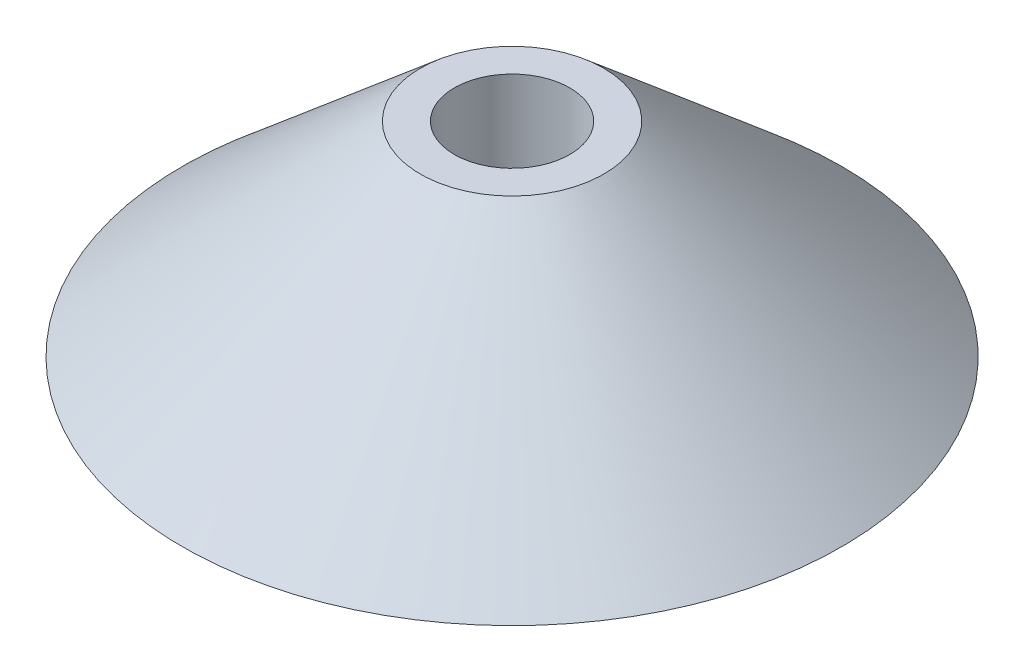
ISO-10303-21;
HEADER;
FILE_DESCRIPTION(('STEP AP214'),'2;1');
FILE_NAME('part.step','',(''),(''),'','','');
FILE_SCHEMA(('AUTOMOTIVE_DESIGN { 1 0 10303 214 1 1 1 1 }'));
ENDSEC;
DATA;
#1=APPLICATION_CONTEXT('core data for automotive mechanical design processes');
#2=APPLICATION_PROTOCOL_DEFINITION('international standard','automotive_design',2000,#1);
#3=PRODUCT_CONTEXT('',#1,'mechanical');
#4=PRODUCT('Part','Part','',(#3));
#5=PRODUCT_RELATED_PRODUCT_CATEGORY('part','',(#4));
#6=PRODUCT_DEFINITION_FORMATION('','',#4);
#7=PRODUCT_DEFINITION_CONTEXT('part definition',#1,'design');
#8=PRODUCT_DEFINITION('design','',#6,#7);
#9=PRODUCT_DEFINITION_SHAPE('','',#8);
#10=(LENGTH_UNIT() NAMED_UNIT(*) SI_UNIT(.MILLI.,.METRE.));
#11=(NAMED_UNIT(*) PLANE_ANGLE_UNIT() SI_UNIT($,.RADIAN.));
#12=(NAMED_UNIT(*) SI_UNIT($,.STERADIAN.) SOLID_ANGLE_UNIT());
#13=UNCERTAINTY_MEASURE_WITH_UNIT(LENGTH_MEASURE(1.E-05),#10,'distance_accuracy_value','');
#14=(GEOMETRIC_REPRESENTATION_CONTEXT(3) GLOBAL_UNCERTAINTY_ASSIGNED_CONTEXT((#13)) GLOBAL_UNIT_ASSIGNED_CONTEXT((#10,
#11,#12)) REPRESENTATION_CONTEXT('',''));
#15=CARTESIAN_POINT('',(0.,0.,0.));
#16=DIRECTION('',(0.,0.,1.));
#17=DIRECTION('',(1.,0.,0.));
#18=AXIS2_PLACEMENT_3D('',#15,#16,#17);
#19=CARTESIAN_POINT('',(-2.7,6.,0.));
#20=DIRECTION('',(0.,1.,0.));
#21=DIRECTION('',(0.,0.,1.));
#22=AXIS2_PLACEMENT_3D('',#19,#20,#21);
#23=PLANE('',#22);
#24=CARTESIAN_POINT('',(0.,6.,0.));
#25=DIRECTION('',(0.,1.,0.));
#26=DIRECTION('',(0.,0.,1.));
#27=AXIS2_PLACEMENT_3D('',#24,#25,#26);
#28=CIRCLE('',#27,2.7);
#29=CARTESIAN_POINT('',(0.,6.,-2.7));
#30=VERTEX_POINT('',#29);
#31=EDGE_CURVE('E46',#30,#30,#28,.T.);
#32=ORIENTED_EDGE('',*,*,#31,.T.);
#33=EDGE_LOOP('',(#32));
#34=FACE_BOUND('',#33,.T.);
#35=CARTESIAN_POINT('',(0.,6.,0.));
#36=DIRECTION('',(0.,1.,0.));
#37=DIRECTION('',(0.,0.,1.));
#38=AXIS2_PLACEMENT_3D('',#35,#36,#37);
#39=CIRCLE('',#38,1.7);
#40=CARTESIAN_POINT('',(0.,6.,1.7));
#41=VERTEX_POINT('',#40);
#42=EDGE_CURVE('E10',#41,#41,#39,.T.);
#43=ORIENTED_EDGE('',*,*,#42,.F.);
#44=EDGE_LOOP('',(#43));
#45=FACE_BOUND('',#44,.T.);
#46=ADVANCED_FACE('F32',(#34,#45),#23,.T.);
#47=CARTESIAN_POINT('',(0.,11.3265306122449,0.));
#48=DIRECTION('',(0.,1.,0.));
#49=DIRECTION('',(0.,0.,1.));
#50=AXIS2_PLACEMENT_3D('',#47,#48,#49);
#51=CYLINDRICAL_SURFACE('',#50,1.7);
#52=ORIENTED_EDGE('',*,*,#42,.T.);
#53=EDGE_LOOP('',(#52));
#54=FACE_BOUND('',#53,.T.);
#55=CARTESIAN_POINT('',(0.,0.,0.));
#56=DIRECTION('',(0.,1.,0.));
#57=DIRECTION('',(0.,0.,1.));
#58=AXIS2_PLACEMENT_3D('',#55,#56,#57);
#59=CIRCLE('',#58,1.7);
#60=CARTESIAN_POINT('',(0.,0.,1.7));
#61=VERTEX_POINT('',#60);
#62=EDGE_CURVE('E38',#61,#61,#59,.T.);
#63=ORIENTED_EDGE('',*,*,#62,.F.);
#64=EDGE_LOOP('',(#63));
#65=FACE_BOUND('',#64,.T.);
#66=ADVANCED_FACE('F62',(#54,#65),#51,.F.);
#67=CARTESIAN_POINT('',(-9.7,0.,0.));
#68=DIRECTION('',(0.,-1.,0.));
#69=DIRECTION('',(0.,0.,-1.));
#70=AXIS2_PLACEMENT_3D('',#67,#68,#69);
#71=PLANE('',#70);
#72=ORIENTED_EDGE('',*,*,#62,.T.);
#73=EDGE_LOOP('',(#72));
#74=FACE_BOUND('',#73,.T.);
#75=CARTESIAN_POINT('',(0.,0.,0.));
#76=DIRECTION('',(0.,1.,0.));
#77=DIRECTION('',(0.,0.,1.));
#78=AXIS2_PLACEMENT_3D('',#75,#76,#77);
#79=CIRCLE('',#78,9.7);
#80=CARTESIAN_POINT('',(0.,0.,-9.7));
#81=VERTEX_POINT('',#80);
#82=EDGE_CURVE('E42',#81,#81,#79,.T.);
#83=ORIENTED_EDGE('',*,*,#82,.F.);
#84=EDGE_LOOP('',(#83));
#85=FACE_BOUND('',#84,.T.);
#86=ADVANCED_FACE('F56',(#74,#85),#71,.T.);
#87=CARTESIAN_POINT('',(0.,6.,0.));
#88=DIRECTION('',(0.,-1.,0.));
#89=DIRECTION('',(0.,0.,-1.));
#90=AXIS2_PLACEMENT_3D('',#87,#88,#89);
#91=CONICAL_SURFACE('',#90,2.7,0.862170054667226);
#92=CARTESIAN_POINT('',(0.,0.,-9.7));
#93=CARTESIAN_POINT('',(0.,0.0625000000000002,-9.62708333333333));
#94=CARTESIAN_POINT('',(0.,0.125,-9.55416666666667));
#95=CARTESIAN_POINT('',(0.,0.25,-9.40833333333333));
#96=CARTESIAN_POINT('',(0.,0.3125,-9.33541666666667));
#97=CARTESIAN_POINT('',(0.,0.4375,-9.18958333333333));
#98=CARTESIAN_POINT('',(0.,0.5,-9.11666666666667));
#99=CARTESIAN_POINT('',(0.,0.625,-8.97083333333333));
#100=CARTESIAN_POINT('',(0.,0.6875,-8.89791666666667));
#101=CARTESIAN_POINT('',(0.,0.8125,-8.75208333333333));
#102=CARTESIAN_POINT('',(0.,0.875,-8.67916666666667));
#103=CARTESIAN_POINT('',(0.,1.,-8.53333333333333));
#104=CARTESIAN_POINT('',(0.,1.0625,-8.46041666666667));
#105=CARTESIAN_POINT('',(0.,1.1875,-8.31458333333333));
#106=CARTESIAN_POINT('',(0.,1.25,-8.24166666666667));
#107=CARTESIAN_POINT('',(0.,1.375,-8.09583333333333));
#108=CARTESIAN_POINT('',(0.,1.4375,-8.02291666666667));
#109=CARTESIAN_POINT('',(0.,1.5625,-7.87708333333333));
#110=CARTESIAN_POINT('',(0.,1.625,-7.80416666666667));
#111=CARTESIAN_POINT('',(0.,1.75,-7.65833333333333));
#112=CARTESIAN_POINT('',(0.,1.8125,-7.58541666666667));
#113=CARTESIAN_POINT('',(0.,1.9375,-7.43958333333333));
#114=CARTESIAN_POINT('',(0.,2.,-7.36666666666667));
#115=CARTESIAN_POINT('',(0.,2.125,-7.22083333333333));
#116=CARTESIAN_POINT('',(0.,2.1875,-7.14791666666667));
#117=CARTESIAN_POINT('',(0.,2.3125,-7.00208333333333));
#118=CARTESIAN_POINT('',(0.,2.375,-6.92916666666667));
#119=CARTESIAN_POINT('',(0.,2.5,-6.78333333333333));
#120=CARTESIAN_POINT('',(0.,2.5625,-6.71041666666667));
#121=CARTESIAN_POINT('',(0.,2.6875,-6.56458333333333));
#122=CARTESIAN_POINT('',(0.,2.75,-6.49166666666667));
#123=CARTESIAN_POINT('',(0.,2.875,-6.34583333333333));
#124=CARTESIAN_POINT('',(0.,2.9375,-6.27291666666667));
#125=CARTESIAN_POINT('',(0.,3.0625,-6.12708333333333));
#126=CARTESIAN_POINT('',(0.,3.125,-6.05416666666667));
#127=CARTESIAN_POINT('',(0.,3.25,-5.90833333333333));
#128=CARTESIAN_POINT('',(0.,3.3125,-5.83541666666667));
#129=CARTESIAN_POINT('',(0.,3.4375,-5.68958333333333));
#130=CARTESIAN_POINT('',(0.,3.5,-5.61666666666667));
#131=CARTESIAN_POINT('',(0.,3.625,-5.47083333333333));
#132=CARTESIAN_POINT('',(0.,3.6875,-5.39791666666667));
#133=CARTESIAN_POINT('',(0.,3.8125,-5.25208333333333));
#134=CARTESIAN_POINT('',(0.,3.875,-5.17916666666667));
#135=CARTESIAN_POINT('',(0.,4.,-5.03333333333333));
#136=CARTESIAN_POINT('',(0.,4.0625,-4.96041666666667));
#137=CARTESIAN_POINT('',(0.,4.1875,-4.81458333333333));
#138=CARTESIAN_POINT('',(0.,4.25,-4.74166666666667));
#139=CARTESIAN_POINT('',(0.,4.375,-4.59583333333333));
#140=CARTESIAN_POINT('',(0.,4.4375,-4.52291666666667));
#141=CARTESIAN_POINT('',(0.,4.5625,-4.37708333333333));
#142=CARTESIAN_POINT('',(0.,4.625,-4.30416666666667));
#143=CARTESIAN_POINT('',(0.,4.75,-4.15833333333333));
#144=CARTESIAN_POINT('',(0.,4.8125,-4.08541666666667));
#145=CARTESIAN_POINT('',(0.,4.9375,-3.93958333333333));
#146=CARTESIAN_POINT('',(0.,5.,-3.86666666666667));
#147=CARTESIAN_POINT('',(0.,5.125,-3.72083333333333));
#148=CARTESIAN_POINT('',(0.,5.1875,-3.64791666666667));
#149=CARTESIAN_POINT('',(0.,5.3125,-3.50208333333333));
#150=CARTESIAN_POINT('',(0.,5.375,-3.42916666666667));
#151=CARTESIAN_POINT('',(0.,5.5,-3.28333333333333));
#152=CARTESIAN_POINT('',(0.,5.5625,-3.21041666666667));
#153=CARTESIAN_POINT('',(0.,5.6875,-3.06458333333333));
#154=CARTESIAN_POINT('',(0.,5.75,-2.99166666666667));
#155=CARTESIAN_POINT('',(0.,5.875,-2.84583333333333));
#156=CARTESIAN_POINT('',(0.,5.9375,-2.77291666666667));
#157=CARTESIAN_POINT('',(0.,6.,-2.7));
#158=B_SPLINE_CURVE_WITH_KNOTS('',3,(#92,#93,#94,#95,#96,#97,#98,#99,#100,#101,#102,#103,#104,
#105,#106,#107,#108,#109,#110,#111,#112,#113,#114,#115,#116,#117,#118,#119,#120,#121,#122,#123,
#124,#125,#126,#127,#128,#129,#130,#131,#132,#133,#134,#135,#136,#137,#138,#139,#140,#141,#142,
#143,#144,#145,#146,#147,#148,#149,#150,#151,#152,#153,#154,#155,#156,#157),.UNSPECIFIED.,.F.,
.F.,(4,2,2,2,2,2,2,2,2,2,2,2,2,2,2,2,2,2,2,2,2,2,2,2,2,2,2,2,2,2,2,2,4),(0.,0.288110764290403,
0.576221528580806,0.864332292871207,1.15244305716161,1.44055382145201,1.72866458574242,
2.01677535003282,2.30488611432322,2.59299687861362,2.88110764290403,3.16921840719443,
3.45732917148483,3.74543993577523,4.03355070006564,4.32166146435604,4.60977222864644,
4.89788299293685,5.18599375722725,5.47410452151765,5.76221528580805,6.05032605009846,
6.33843681438886,6.62654757867926,6.91465834296967,7.20276910726007,7.49087987155047,
7.77899063584087,8.06710140013127,8.35521216442168,8.64332292871208,8.93143369300248,
9.21954445729289),.UNSPECIFIED.);
#159=EDGE_CURVE('BSEAM54',#81,#30,#158,.T.);
#160=ORIENTED_EDGE('',*,*,#82,.T.);
#161=ORIENTED_EDGE('',*,*,#31,.F.);
#162=ORIENTED_EDGE('',*,*,#159,.T.);
#163=ORIENTED_EDGE('',*,*,#159,.F.);
#164=EDGE_LOOP('',(#160,#162,#161,#163));
#165=FACE_BOUND('',#164,.T.);
#166=ADVANCED_FACE('F54',(#165),#91,.T.);
#167=CLOSED_SHELL('',(#46,#66,#86,#166));
#168=MANIFOLD_SOLID_BREP('B2',#167);
#169=ADVANCED_BREP_SHAPE_REPRESENTATION('',(#18,#168),#14);
#170=SHAPE_DEFINITION_REPRESENTATION(#9,#169);
ENDSEC;
END-ISO-10303-21;
